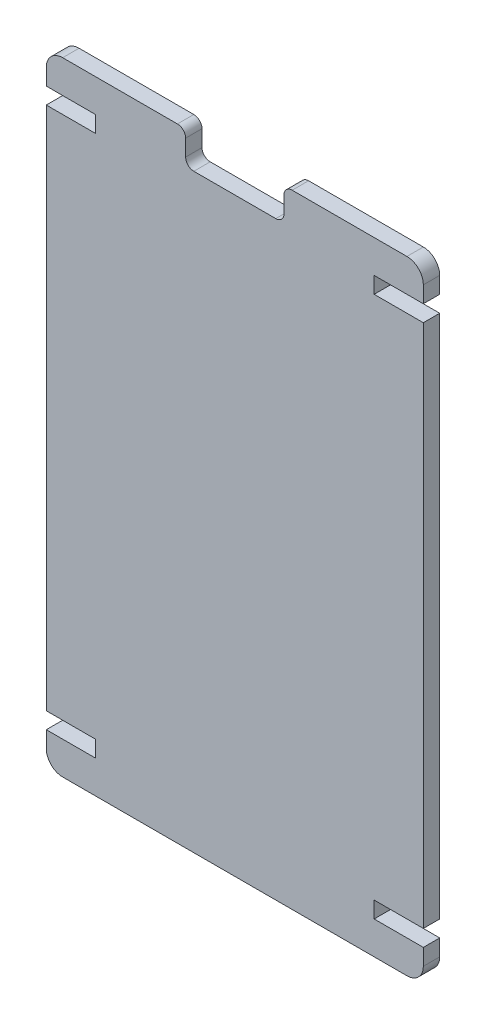
ISO-10303-21;
HEADER;
FILE_DESCRIPTION(('STEP AP214'),'2;1');
FILE_NAME('part.step','',(''),(''),'','','');
FILE_SCHEMA(('AUTOMOTIVE_DESIGN { 1 0 10303 214 1 1 1 1 }'));
ENDSEC;
DATA;
#1=APPLICATION_CONTEXT('core data for automotive mechanical design processes');
#2=APPLICATION_PROTOCOL_DEFINITION('international standard','automotive_design',2000,#1);
#3=PRODUCT_CONTEXT('',#1,'mechanical');
#4=PRODUCT('Part','Part','',(#3));
#5=PRODUCT_RELATED_PRODUCT_CATEGORY('part','',(#4));
#6=PRODUCT_DEFINITION_FORMATION('','',#4);
#7=PRODUCT_DEFINITION_CONTEXT('part definition',#1,'design');
#8=PRODUCT_DEFINITION('design','',#6,#7);
#9=PRODUCT_DEFINITION_SHAPE('','',#8);
#10=(LENGTH_UNIT() NAMED_UNIT(*) SI_UNIT(.MILLI.,.METRE.));
#11=(NAMED_UNIT(*) PLANE_ANGLE_UNIT() SI_UNIT($,.RADIAN.));
#12=(NAMED_UNIT(*) SI_UNIT($,.STERADIAN.) SOLID_ANGLE_UNIT());
#13=UNCERTAINTY_MEASURE_WITH_UNIT(LENGTH_MEASURE(1.E-05),#10,'distance_accuracy_value','');
#14=(GEOMETRIC_REPRESENTATION_CONTEXT(3) GLOBAL_UNCERTAINTY_ASSIGNED_CONTEXT((#13)) GLOBAL_UNIT_ASSIGNED_CONTEXT((#10,
#11,#12)) REPRESENTATION_CONTEXT('',''));
#15=CARTESIAN_POINT('',(0.,0.,0.));
#16=DIRECTION('',(0.,0.,1.));
#17=DIRECTION('',(1.,0.,0.));
#18=AXIS2_PLACEMENT_3D('',#15,#16,#17);
#19=CARTESIAN_POINT('',(-23.,-34.,2.));
#20=DIRECTION('',(1.,0.,0.));
#21=DIRECTION('',(0.,1.,0.));
#22=AXIS2_PLACEMENT_3D('',#19,#20,#21);
#23=PLANE('',#22);
#24=DIRECTION('',(0.,-1.,0.));
#25=VECTOR('',#24,1.);
#26=CARTESIAN_POINT('',(-23.,-34.,0.));
#27=LINE('',#26,#25);
#28=CARTESIAN_POINT('',(-23.,-34.,0.));
#29=VERTEX_POINT('',#28);
#30=CARTESIAN_POINT('',(-23.,-36.,0.));
#31=VERTEX_POINT('',#30);
#32=EDGE_CURVE('E273',#29,#31,#27,.T.);
#33=ORIENTED_EDGE('',*,*,#32,.T.);
#34=DIRECTION('',(0.,0.,-1.));
#35=VECTOR('',#34,1.);
#36=CARTESIAN_POINT('',(-23.,-36.,2.));
#37=LINE('',#36,#35);
#38=CARTESIAN_POINT('',(-23.,-36.,2.));
#39=VERTEX_POINT('',#38);
#40=EDGE_CURVE('E11',#39,#31,#37,.T.);
#41=ORIENTED_EDGE('',*,*,#40,.F.);
#42=DIRECTION('',(0.,-1.,0.));
#43=VECTOR('',#42,1.);
#44=CARTESIAN_POINT('',(-23.,-34.,2.));
#45=LINE('',#44,#43);
#46=CARTESIAN_POINT('',(-23.,-34.,2.));
#47=VERTEX_POINT('',#46);
#48=EDGE_CURVE('E335',#47,#39,#45,.T.);
#49=ORIENTED_EDGE('',*,*,#48,.F.);
#50=DIRECTION('',(0.,0.,-1.));
#51=VECTOR('',#50,1.);
#52=CARTESIAN_POINT('',(-23.,-34.,2.));
#53=LINE('',#52,#51);
#54=EDGE_CURVE('E269',#47,#29,#53,.T.);
#55=ORIENTED_EDGE('',*,*,#54,.T.);
#56=EDGE_LOOP('',(#33,#41,#49,#55));
#57=FACE_BOUND('',#56,.T.);
#58=ADVANCED_FACE('F33',(#57),#23,.F.);
#59=CARTESIAN_POINT('',(-21.,-36.,2.));
#60=DIRECTION('',(0.,0.,-1.));
#61=DIRECTION('',(-1.,0.,0.));
#62=AXIS2_PLACEMENT_3D('',#59,#60,#61);
#63=CYLINDRICAL_SURFACE('',#62,2.);
#64=CARTESIAN_POINT('',(-21.,-36.,0.));
#65=DIRECTION('',(0.,0.,1.));
#66=DIRECTION('',(1.,0.,0.));
#67=AXIS2_PLACEMENT_3D('',#64,#65,#66);
#68=CIRCLE('',#67,2.);
#69=CARTESIAN_POINT('',(-21.,-38.,0.));
#70=VERTEX_POINT('',#69);
#71=EDGE_CURVE('E276',#31,#70,#68,.T.);
#72=ORIENTED_EDGE('',*,*,#71,.T.);
#73=DIRECTION('',(0.,0.,-1.));
#74=VECTOR('',#73,1.);
#75=CARTESIAN_POINT('',(-21.,-38.,2.));
#76=LINE('',#75,#74);
#77=CARTESIAN_POINT('',(-21.,-38.,2.));
#78=VERTEX_POINT('',#77);
#79=EDGE_CURVE('E41',#78,#70,#76,.T.);
#80=ORIENTED_EDGE('',*,*,#79,.F.);
#81=CARTESIAN_POINT('',(-21.,-36.,2.));
#82=DIRECTION('',(0.,0.,1.));
#83=DIRECTION('',(1.,0.,0.));
#84=AXIS2_PLACEMENT_3D('',#81,#82,#83);
#85=CIRCLE('',#84,2.);
#86=EDGE_CURVE('E164',#39,#78,#85,.T.);
#87=ORIENTED_EDGE('',*,*,#86,.F.);
#88=ORIENTED_EDGE('',*,*,#40,.T.);
#89=EDGE_LOOP('',(#72,#80,#87,#88));
#90=FACE_BOUND('',#89,.T.);
#91=ADVANCED_FACE('F513',(#90),#63,.T.);
#92=CARTESIAN_POINT('',(21.,-38.,2.));
#93=DIRECTION('',(0.,1.,0.));
#94=DIRECTION('',(-1.,0.,0.));
#95=AXIS2_PLACEMENT_3D('',#92,#93,#94);
#96=PLANE('',#95);
#97=DIRECTION('',(1.,0.,0.));
#98=VECTOR('',#97,1.);
#99=CARTESIAN_POINT('',(21.,-38.,0.));
#100=LINE('',#99,#98);
#101=CARTESIAN_POINT('',(21.,-38.,0.));
#102=VERTEX_POINT('',#101);
#103=EDGE_CURVE('E278',#70,#102,#100,.T.);
#104=ORIENTED_EDGE('',*,*,#103,.T.);
#105=DIRECTION('',(0.,0.,-1.));
#106=VECTOR('',#105,1.);
#107=CARTESIAN_POINT('',(21.,-38.,2.));
#108=LINE('',#107,#106);
#109=CARTESIAN_POINT('',(21.,-38.,2.));
#110=VERTEX_POINT('',#109);
#111=EDGE_CURVE('E414',#110,#102,#108,.T.);
#112=ORIENTED_EDGE('',*,*,#111,.F.);
#113=DIRECTION('',(1.,0.,0.));
#114=VECTOR('',#113,1.);
#115=CARTESIAN_POINT('',(21.,-38.,2.));
#116=LINE('',#115,#114);
#117=EDGE_CURVE('E422',#78,#110,#116,.T.);
#118=ORIENTED_EDGE('',*,*,#117,.F.);
#119=ORIENTED_EDGE('',*,*,#79,.T.);
#120=EDGE_LOOP('',(#104,#112,#118,#119));
#121=FACE_BOUND('',#120,.T.);
#122=ADVANCED_FACE('F420',(#121),#96,.F.);
#123=CARTESIAN_POINT('',(21.,-36.,2.));
#124=DIRECTION('',(0.,0.,-1.));
#125=DIRECTION('',(-1.,0.,0.));
#126=AXIS2_PLACEMENT_3D('',#123,#124,#125);
#127=CYLINDRICAL_SURFACE('',#126,2.);
#128=CARTESIAN_POINT('',(21.,-36.,0.));
#129=DIRECTION('',(0.,0.,1.));
#130=DIRECTION('',(-1.,0.,0.));
#131=AXIS2_PLACEMENT_3D('',#128,#129,#130);
#132=CIRCLE('',#131,2.);
#133=CARTESIAN_POINT('',(23.,-36.,0.));
#134=VERTEX_POINT('',#133);
#135=EDGE_CURVE('E280',#102,#134,#132,.T.);
#136=ORIENTED_EDGE('',*,*,#135,.T.);
#137=DIRECTION('',(0.,0.,-1.));
#138=VECTOR('',#137,1.);
#139=CARTESIAN_POINT('',(23.,-36.,2.));
#140=LINE('',#139,#138);
#141=CARTESIAN_POINT('',(23.,-36.,2.));
#142=VERTEX_POINT('',#141);
#143=EDGE_CURVE('E411',#142,#134,#140,.T.);
#144=ORIENTED_EDGE('',*,*,#143,.F.);
#145=CARTESIAN_POINT('',(21.,-36.,2.));
#146=DIRECTION('',(0.,0.,1.));
#147=DIRECTION('',(-1.,0.,0.));
#148=AXIS2_PLACEMENT_3D('',#145,#146,#147);
#149=CIRCLE('',#148,2.);
#150=EDGE_CURVE('E440',#110,#142,#149,.T.);
#151=ORIENTED_EDGE('',*,*,#150,.F.);
#152=ORIENTED_EDGE('',*,*,#111,.T.);
#153=EDGE_LOOP('',(#136,#144,#151,#152));
#154=FACE_BOUND('',#153,.T.);
#155=ADVANCED_FACE('F431',(#154),#127,.T.);
#156=CARTESIAN_POINT('',(23.,-34.,2.));
#157=DIRECTION('',(-1.,0.,0.));
#158=DIRECTION('',(0.,0.,1.));
#159=AXIS2_PLACEMENT_3D('',#156,#157,#158);
#160=PLANE('',#159);
#161=DIRECTION('',(0.,1.,0.));
#162=VECTOR('',#161,1.);
#163=CARTESIAN_POINT('',(23.,-34.,0.));
#164=LINE('',#163,#162);
#165=CARTESIAN_POINT('',(23.,-34.,0.));
#166=VERTEX_POINT('',#165);
#167=EDGE_CURVE('E282',#134,#166,#164,.T.);
#168=ORIENTED_EDGE('',*,*,#167,.T.);
#169=DIRECTION('',(0.,0.,-1.));
#170=VECTOR('',#169,1.);
#171=CARTESIAN_POINT('',(23.,-34.,2.));
#172=LINE('',#171,#170);
#173=CARTESIAN_POINT('',(23.,-34.,2.));
#174=VERTEX_POINT('',#173);
#175=EDGE_CURVE('E408',#174,#166,#172,.T.);
#176=ORIENTED_EDGE('',*,*,#175,.F.);
#177=DIRECTION('',(0.,1.,0.));
#178=VECTOR('',#177,1.);
#179=CARTESIAN_POINT('',(23.,-34.,2.));
#180=LINE('',#179,#178);
#181=EDGE_CURVE('E437',#142,#174,#180,.T.);
#182=ORIENTED_EDGE('',*,*,#181,.F.);
#183=ORIENTED_EDGE('',*,*,#143,.T.);
#184=EDGE_LOOP('',(#168,#176,#182,#183));
#185=FACE_BOUND('',#184,.T.);
#186=ADVANCED_FACE('F435',(#185),#160,.F.);
#187=CARTESIAN_POINT('',(23.,-34.,2.));
#188=DIRECTION('',(0.,-1.,0.));
#189=DIRECTION('',(0.,0.,-1.));
#190=AXIS2_PLACEMENT_3D('',#187,#188,#189);
#191=PLANE('',#190);
#192=DIRECTION('',(-1.,0.,0.));
#193=VECTOR('',#192,1.);
#194=CARTESIAN_POINT('',(23.,-34.,0.));
#195=LINE('',#194,#193);
#196=CARTESIAN_POINT('',(17.,-34.,0.));
#197=VERTEX_POINT('',#196);
#198=EDGE_CURVE('E284',#166,#197,#195,.T.);
#199=ORIENTED_EDGE('',*,*,#198,.T.);
#200=DIRECTION('',(0.,0.,-1.));
#201=VECTOR('',#200,1.);
#202=CARTESIAN_POINT('',(17.,-34.,2.));
#203=LINE('',#202,#201);
#204=CARTESIAN_POINT('',(17.,-34.,2.));
#205=VERTEX_POINT('',#204);
#206=EDGE_CURVE('E405',#205,#197,#203,.T.);
#207=ORIENTED_EDGE('',*,*,#206,.F.);
#208=DIRECTION('',(-1.,0.,0.));
#209=VECTOR('',#208,1.);
#210=CARTESIAN_POINT('',(23.,-34.,2.));
#211=LINE('',#210,#209);
#212=EDGE_CURVE('E439',#174,#205,#211,.T.);
#213=ORIENTED_EDGE('',*,*,#212,.F.);
#214=ORIENTED_EDGE('',*,*,#175,.T.);
#215=EDGE_LOOP('',(#199,#207,#213,#214));
#216=FACE_BOUND('',#215,.T.);
#217=ADVANCED_FACE('F526',(#216),#191,.F.);
#218=CARTESIAN_POINT('',(17.,-34.,2.));
#219=DIRECTION('',(-1.,0.,0.));
#220=DIRECTION('',(0.,-1.,0.));
#221=AXIS2_PLACEMENT_3D('',#218,#219,#220);
#222=PLANE('',#221);
#223=DIRECTION('',(0.,1.,0.));
#224=VECTOR('',#223,1.);
#225=CARTESIAN_POINT('',(17.,-34.,0.));
#226=LINE('',#225,#224);
#227=CARTESIAN_POINT('',(17.,-32.,0.));
#228=VERTEX_POINT('',#227);
#229=EDGE_CURVE('E286',#197,#228,#226,.T.);
#230=ORIENTED_EDGE('',*,*,#229,.T.);
#231=DIRECTION('',(0.,0.,-1.));
#232=VECTOR('',#231,1.);
#233=CARTESIAN_POINT('',(17.,-32.,2.));
#234=LINE('',#233,#232);
#235=CARTESIAN_POINT('',(17.,-32.,2.));
#236=VERTEX_POINT('',#235);
#237=EDGE_CURVE('E402',#236,#228,#234,.T.);
#238=ORIENTED_EDGE('',*,*,#237,.F.);
#239=DIRECTION('',(0.,1.,0.));
#240=VECTOR('',#239,1.);
#241=CARTESIAN_POINT('',(17.,-34.,2.));
#242=LINE('',#241,#240);
#243=EDGE_CURVE('E442',#205,#236,#242,.T.);
#244=ORIENTED_EDGE('',*,*,#243,.F.);
#245=ORIENTED_EDGE('',*,*,#206,.T.);
#246=EDGE_LOOP('',(#230,#238,#244,#245));
#247=FACE_BOUND('',#246,.T.);
#248=ADVANCED_FACE('F529',(#247),#222,.F.);
#249=CARTESIAN_POINT('',(17.,-32.,2.));
#250=DIRECTION('',(0.,1.,0.));
#251=DIRECTION('',(0.,0.,1.));
#252=AXIS2_PLACEMENT_3D('',#249,#250,#251);
#253=PLANE('',#252);
#254=DIRECTION('',(1.,0.,0.));
#255=VECTOR('',#254,1.);
#256=CARTESIAN_POINT('',(17.,-32.,0.));
#257=LINE('',#256,#255);
#258=CARTESIAN_POINT('',(23.,-32.,0.));
#259=VERTEX_POINT('',#258);
#260=EDGE_CURVE('E288',#228,#259,#257,.T.);
#261=ORIENTED_EDGE('',*,*,#260,.T.);
#262=DIRECTION('',(0.,0.,-1.));
#263=VECTOR('',#262,1.);
#264=CARTESIAN_POINT('',(23.,-32.,2.));
#265=LINE('',#264,#263);
#266=CARTESIAN_POINT('',(23.,-32.,2.));
#267=VERTEX_POINT('',#266);
#268=EDGE_CURVE('E399',#267,#259,#265,.T.);
#269=ORIENTED_EDGE('',*,*,#268,.F.);
#270=DIRECTION('',(1.,0.,0.));
#271=VECTOR('',#270,1.);
#272=CARTESIAN_POINT('',(17.,-32.,2.));
#273=LINE('',#272,#271);
#274=EDGE_CURVE('E448',#236,#267,#273,.T.);
#275=ORIENTED_EDGE('',*,*,#274,.F.);
#276=ORIENTED_EDGE('',*,*,#237,.T.);
#277=EDGE_LOOP('',(#261,#269,#275,#276));
#278=FACE_BOUND('',#277,.T.);
#279=ADVANCED_FACE('F533',(#278),#253,.F.);
#280=CARTESIAN_POINT('',(23.,32.,2.));
#281=DIRECTION('',(-1.,0.,0.));
#282=DIRECTION('',(0.,-1.,0.));
#283=AXIS2_PLACEMENT_3D('',#280,#281,#282);
#284=PLANE('',#283);
#285=DIRECTION('',(0.,1.,0.));
#286=VECTOR('',#285,1.);
#287=CARTESIAN_POINT('',(23.,32.,0.));
#288=LINE('',#287,#286);
#289=CARTESIAN_POINT('',(23.,32.,0.));
#290=VERTEX_POINT('',#289);
#291=EDGE_CURVE('E290',#259,#290,#288,.T.);
#292=ORIENTED_EDGE('',*,*,#291,.T.);
#293=DIRECTION('',(0.,0.,-1.));
#294=VECTOR('',#293,1.);
#295=CARTESIAN_POINT('',(23.,32.,2.));
#296=LINE('',#295,#294);
#297=CARTESIAN_POINT('',(23.,32.,2.));
#298=VERTEX_POINT('',#297);
#299=EDGE_CURVE('E396',#298,#290,#296,.T.);
#300=ORIENTED_EDGE('',*,*,#299,.F.);
#301=DIRECTION('',(0.,1.,0.));
#302=VECTOR('',#301,1.);
#303=CARTESIAN_POINT('',(23.,32.,2.));
#304=LINE('',#303,#302);
#305=EDGE_CURVE('E450',#267,#298,#304,.T.);
#306=ORIENTED_EDGE('',*,*,#305,.F.);
#307=ORIENTED_EDGE('',*,*,#268,.T.);
#308=EDGE_LOOP('',(#292,#300,#306,#307));
#309=FACE_BOUND('',#308,.T.);
#310=ADVANCED_FACE('F537',(#309),#284,.F.);
#311=CARTESIAN_POINT('',(17.,32.,2.));
#312=DIRECTION('',(0.,-1.,0.));
#313=DIRECTION('',(0.,0.,-1.));
#314=AXIS2_PLACEMENT_3D('',#311,#312,#313);
#315=PLANE('',#314);
#316=DIRECTION('',(-1.,0.,0.));
#317=VECTOR('',#316,1.);
#318=CARTESIAN_POINT('',(17.,32.,0.));
#319=LINE('',#318,#317);
#320=CARTESIAN_POINT('',(17.,32.,0.));
#321=VERTEX_POINT('',#320);
#322=EDGE_CURVE('E292',#290,#321,#319,.T.);
#323=ORIENTED_EDGE('',*,*,#322,.T.);
#324=DIRECTION('',(0.,0.,-1.));
#325=VECTOR('',#324,1.);
#326=CARTESIAN_POINT('',(17.,32.,2.));
#327=LINE('',#326,#325);
#328=CARTESIAN_POINT('',(17.,32.,2.));
#329=VERTEX_POINT('',#328);
#330=EDGE_CURVE('E393',#329,#321,#327,.T.);
#331=ORIENTED_EDGE('',*,*,#330,.F.);
#332=DIRECTION('',(-1.,0.,0.));
#333=VECTOR('',#332,1.);
#334=CARTESIAN_POINT('',(17.,32.,2.));
#335=LINE('',#334,#333);
#336=EDGE_CURVE('E452',#298,#329,#335,.T.);
#337=ORIENTED_EDGE('',*,*,#336,.F.);
#338=ORIENTED_EDGE('',*,*,#299,.T.);
#339=EDGE_LOOP('',(#323,#331,#337,#338));
#340=FACE_BOUND('',#339,.T.);
#341=ADVANCED_FACE('F541',(#340),#315,.F.);
#342=CARTESIAN_POINT('',(17.,34.,2.));
#343=DIRECTION('',(-1.,0.,0.));
#344=DIRECTION('',(0.,-1.,0.));
#345=AXIS2_PLACEMENT_3D('',#342,#343,#344);
#346=PLANE('',#345);
#347=DIRECTION('',(0.,1.,0.));
#348=VECTOR('',#347,1.);
#349=CARTESIAN_POINT('',(17.,34.,0.));
#350=LINE('',#349,#348);
#351=CARTESIAN_POINT('',(17.,34.,0.));
#352=VERTEX_POINT('',#351);
#353=EDGE_CURVE('E294',#321,#352,#350,.T.);
#354=ORIENTED_EDGE('',*,*,#353,.T.);
#355=DIRECTION('',(0.,0.,-1.));
#356=VECTOR('',#355,1.);
#357=CARTESIAN_POINT('',(17.,34.,2.));
#358=LINE('',#357,#356);
#359=CARTESIAN_POINT('',(17.,34.,2.));
#360=VERTEX_POINT('',#359);
#361=EDGE_CURVE('E390',#360,#352,#358,.T.);
#362=ORIENTED_EDGE('',*,*,#361,.F.);
#363=DIRECTION('',(0.,1.,0.));
#364=VECTOR('',#363,1.);
#365=CARTESIAN_POINT('',(17.,34.,2.));
#366=LINE('',#365,#364);
#367=EDGE_CURVE('E454',#329,#360,#366,.T.);
#368=ORIENTED_EDGE('',*,*,#367,.F.);
#369=ORIENTED_EDGE('',*,*,#330,.T.);
#370=EDGE_LOOP('',(#354,#362,#368,#369));
#371=FACE_BOUND('',#370,.T.);
#372=ADVANCED_FACE('F545',(#371),#346,.F.);
#373=CARTESIAN_POINT('',(23.,34.,2.));
#374=DIRECTION('',(0.,1.,0.));
#375=DIRECTION('',(0.,0.,1.));
#376=AXIS2_PLACEMENT_3D('',#373,#374,#375);
#377=PLANE('',#376);
#378=DIRECTION('',(1.,0.,0.));
#379=VECTOR('',#378,1.);
#380=CARTESIAN_POINT('',(23.,34.,0.));
#381=LINE('',#380,#379);
#382=CARTESIAN_POINT('',(23.,34.,0.));
#383=VERTEX_POINT('',#382);
#384=EDGE_CURVE('E296',#352,#383,#381,.T.);
#385=ORIENTED_EDGE('',*,*,#384,.T.);
#386=DIRECTION('',(0.,0.,-1.));
#387=VECTOR('',#386,1.);
#388=CARTESIAN_POINT('',(23.,34.,2.));
#389=LINE('',#388,#387);
#390=CARTESIAN_POINT('',(23.,34.,2.));
#391=VERTEX_POINT('',#390);
#392=EDGE_CURVE('E387',#391,#383,#389,.T.);
#393=ORIENTED_EDGE('',*,*,#392,.F.);
#394=DIRECTION('',(1.,0.,0.));
#395=VECTOR('',#394,1.);
#396=CARTESIAN_POINT('',(23.,34.,2.));
#397=LINE('',#396,#395);
#398=EDGE_CURVE('E456',#360,#391,#397,.T.);
#399=ORIENTED_EDGE('',*,*,#398,.F.);
#400=ORIENTED_EDGE('',*,*,#361,.T.);
#401=EDGE_LOOP('',(#385,#393,#399,#400));
#402=FACE_BOUND('',#401,.T.);
#403=ADVANCED_FACE('F549',(#402),#377,.F.);
#404=CARTESIAN_POINT('',(23.,36.,2.));
#405=DIRECTION('',(-1.,0.,0.));
#406=DIRECTION('',(0.,0.,1.));
#407=AXIS2_PLACEMENT_3D('',#404,#405,#406);
#408=PLANE('',#407);
#409=DIRECTION('',(0.,1.,0.));
#410=VECTOR('',#409,1.);
#411=CARTESIAN_POINT('',(23.,36.,0.));
#412=LINE('',#411,#410);
#413=CARTESIAN_POINT('',(23.,36.,0.));
#414=VERTEX_POINT('',#413);
#415=EDGE_CURVE('E298',#383,#414,#412,.T.);
#416=ORIENTED_EDGE('',*,*,#415,.T.);
#417=DIRECTION('',(0.,0.,-1.));
#418=VECTOR('',#417,1.);
#419=CARTESIAN_POINT('',(23.,36.,2.));
#420=LINE('',#419,#418);
#421=CARTESIAN_POINT('',(23.,36.,2.));
#422=VERTEX_POINT('',#421);
#423=EDGE_CURVE('E384',#422,#414,#420,.T.);
#424=ORIENTED_EDGE('',*,*,#423,.F.);
#425=DIRECTION('',(0.,1.,0.));
#426=VECTOR('',#425,1.);
#427=CARTESIAN_POINT('',(23.,36.,2.));
#428=LINE('',#427,#426);
#429=EDGE_CURVE('E458',#391,#422,#428,.T.);
#430=ORIENTED_EDGE('',*,*,#429,.F.);
#431=ORIENTED_EDGE('',*,*,#392,.T.);
#432=EDGE_LOOP('',(#416,#424,#430,#431));
#433=FACE_BOUND('',#432,.T.);
#434=ADVANCED_FACE('F553',(#433),#408,.F.);
#435=CARTESIAN_POINT('',(21.,36.,2.));
#436=DIRECTION('',(0.,0.,-1.));
#437=DIRECTION('',(-1.,0.,0.));
#438=AXIS2_PLACEMENT_3D('',#435,#436,#437);
#439=CYLINDRICAL_SURFACE('',#438,2.00000000000001);
#440=CARTESIAN_POINT('',(21.,36.,0.));
#441=DIRECTION('',(0.,0.,1.));
#442=DIRECTION('',(1.,0.,0.));
#443=AXIS2_PLACEMENT_3D('',#440,#441,#442);
#444=CIRCLE('',#443,2.00000000000001);
#445=CARTESIAN_POINT('',(21.,38.,0.));
#446=VERTEX_POINT('',#445);
#447=EDGE_CURVE('E300',#414,#446,#444,.T.);
#448=ORIENTED_EDGE('',*,*,#447,.T.);
#449=DIRECTION('',(0.,0.,-1.));
#450=VECTOR('',#449,1.);
#451=CARTESIAN_POINT('',(21.,38.,2.));
#452=LINE('',#451,#450);
#453=CARTESIAN_POINT('',(21.,38.,2.));
#454=VERTEX_POINT('',#453);
#455=EDGE_CURVE('E381',#454,#446,#452,.T.);
#456=ORIENTED_EDGE('',*,*,#455,.F.);
#457=CARTESIAN_POINT('',(21.,36.,2.));
#458=DIRECTION('',(0.,0.,1.));
#459=DIRECTION('',(1.,0.,0.));
#460=AXIS2_PLACEMENT_3D('',#457,#458,#459);
#461=CIRCLE('',#460,2.00000000000001);
#462=EDGE_CURVE('E460',#422,#454,#461,.T.);
#463=ORIENTED_EDGE('',*,*,#462,.F.);
#464=ORIENTED_EDGE('',*,*,#423,.T.);
#465=EDGE_LOOP('',(#448,#456,#463,#464));
#466=FACE_BOUND('',#465,.T.);
#467=ADVANCED_FACE('F557',(#466),#439,.T.);
#468=CARTESIAN_POINT('',(7.,38.,2.));
#469=DIRECTION('',(0.,-1.,0.));
#470=DIRECTION('',(0.,0.,-1.));
#471=AXIS2_PLACEMENT_3D('',#468,#469,#470);
#472=PLANE('',#471);
#473=DIRECTION('',(-1.,0.,0.));
#474=VECTOR('',#473,1.);
#475=CARTESIAN_POINT('',(7.,38.,0.));
#476=LINE('',#475,#474);
#477=CARTESIAN_POINT('',(7.,38.,0.));
#478=VERTEX_POINT('',#477);
#479=EDGE_CURVE('E302',#446,#478,#476,.T.);
#480=ORIENTED_EDGE('',*,*,#479,.T.);
#481=DIRECTION('',(0.,0.,-1.));
#482=VECTOR('',#481,1.);
#483=CARTESIAN_POINT('',(7.,38.,2.));
#484=LINE('',#483,#482);
#485=CARTESIAN_POINT('',(7.,38.,2.));
#486=VERTEX_POINT('',#485);
#487=EDGE_CURVE('E378',#486,#478,#484,.T.);
#488=ORIENTED_EDGE('',*,*,#487,.F.);
#489=DIRECTION('',(-1.,0.,0.));
#490=VECTOR('',#489,1.);
#491=CARTESIAN_POINT('',(7.,38.,2.));
#492=LINE('',#491,#490);
#493=EDGE_CURVE('E462',#454,#486,#492,.T.);
#494=ORIENTED_EDGE('',*,*,#493,.F.);
#495=ORIENTED_EDGE('',*,*,#455,.T.);
#496=EDGE_LOOP('',(#480,#488,#494,#495));
#497=FACE_BOUND('',#496,.T.);
#498=ADVANCED_FACE('F561',(#497),#472,.F.);
#499=CARTESIAN_POINT('',(6.99999999999999,37.,2.));
#500=DIRECTION('',(0.,0.,-1.));
#501=DIRECTION('',(-1.,0.,0.));
#502=AXIS2_PLACEMENT_3D('',#499,#500,#501);
#503=CYLINDRICAL_SURFACE('',#502,1.);
#504=CARTESIAN_POINT('',(6.99999999999999,37.,0.));
#505=DIRECTION('',(0.,0.,1.));
#506=DIRECTION('',(1.,0.,0.));
#507=AXIS2_PLACEMENT_3D('',#504,#505,#506);
#508=CIRCLE('',#507,1.);
#509=CARTESIAN_POINT('',(5.99999999999999,37.,0.));
#510=VERTEX_POINT('',#509);
#511=EDGE_CURVE('E304',#478,#510,#508,.T.);
#512=ORIENTED_EDGE('',*,*,#511,.T.);
#513=DIRECTION('',(0.,0.,-1.));
#514=VECTOR('',#513,1.);
#515=CARTESIAN_POINT('',(5.99999999999999,37.,2.));
#516=LINE('',#515,#514);
#517=CARTESIAN_POINT('',(5.99999999999999,37.,2.));
#518=VERTEX_POINT('',#517);
#519=EDGE_CURVE('E375',#518,#510,#516,.T.);
#520=ORIENTED_EDGE('',*,*,#519,.F.);
#521=CARTESIAN_POINT('',(6.99999999999999,37.,2.));
#522=DIRECTION('',(0.,0.,1.));
#523=DIRECTION('',(1.,0.,0.));
#524=AXIS2_PLACEMENT_3D('',#521,#522,#523);
#525=CIRCLE('',#524,1.);
#526=EDGE_CURVE('E464',#486,#518,#525,.T.);
#527=ORIENTED_EDGE('',*,*,#526,.F.);
#528=ORIENTED_EDGE('',*,*,#487,.T.);
#529=EDGE_LOOP('',(#512,#520,#527,#528));
#530=FACE_BOUND('',#529,.T.);
#531=ADVANCED_FACE('F565',(#530),#503,.T.);
#532=CARTESIAN_POINT('',(6.,35.,2.));
#533=DIRECTION('',(1.,0.,0.));
#534=DIRECTION('',(0.,1.,0.));
#535=AXIS2_PLACEMENT_3D('',#532,#533,#534);
#536=PLANE('',#535);
#537=DIRECTION('',(0.,-1.,0.));
#538=VECTOR('',#537,1.);
#539=CARTESIAN_POINT('',(6.,35.,0.));
#540=LINE('',#539,#538);
#541=CARTESIAN_POINT('',(6.,35.,0.));
#542=VERTEX_POINT('',#541);
#543=EDGE_CURVE('E306',#510,#542,#540,.T.);
#544=ORIENTED_EDGE('',*,*,#543,.T.);
#545=DIRECTION('',(0.,0.,-1.));
#546=VECTOR('',#545,1.);
#547=CARTESIAN_POINT('',(6.,35.,2.));
#548=LINE('',#547,#546);
#549=CARTESIAN_POINT('',(6.,35.,2.));
#550=VERTEX_POINT('',#549);
#551=EDGE_CURVE('E372',#550,#542,#548,.T.);
#552=ORIENTED_EDGE('',*,*,#551,.F.);
#553=DIRECTION('',(0.,-1.,0.));
#554=VECTOR('',#553,1.);
#555=CARTESIAN_POINT('',(6.,35.,2.));
#556=LINE('',#555,#554);
#557=EDGE_CURVE('E466',#518,#550,#556,.T.);
#558=ORIENTED_EDGE('',*,*,#557,.F.);
#559=ORIENTED_EDGE('',*,*,#519,.T.);
#560=EDGE_LOOP('',(#544,#552,#558,#559));
#561=FACE_BOUND('',#560,.T.);
#562=ADVANCED_FACE('F569',(#561),#536,.F.);
#563=CARTESIAN_POINT('',(5.,35.,2.));
#564=DIRECTION('',(0.,0.,-1.));
#565=DIRECTION('',(-1.,0.,0.));
#566=AXIS2_PLACEMENT_3D('',#563,#564,#565);
#567=CYLINDRICAL_SURFACE('',#566,1.);
#568=CARTESIAN_POINT('',(5.,35.,0.));
#569=DIRECTION('',(0.,0.,-1.));
#570=DIRECTION('',(-1.,0.,0.));
#571=AXIS2_PLACEMENT_3D('',#568,#569,#570);
#572=CIRCLE('',#571,1.);
#573=CARTESIAN_POINT('',(4.99999999999999,34.,0.));
#574=VERTEX_POINT('',#573);
#575=EDGE_CURVE('E308',#542,#574,#572,.T.);
#576=ORIENTED_EDGE('',*,*,#575,.T.);
#577=DIRECTION('',(0.,0.,-1.));
#578=VECTOR('',#577,1.);
#579=CARTESIAN_POINT('',(4.99999999999999,34.,2.));
#580=LINE('',#579,#578);
#581=CARTESIAN_POINT('',(4.99999999999999,34.,2.));
#582=VERTEX_POINT('',#581);
#583=EDGE_CURVE('E369',#582,#574,#580,.T.);
#584=ORIENTED_EDGE('',*,*,#583,.F.);
#585=CARTESIAN_POINT('',(5.,35.,2.));
#586=DIRECTION('',(0.,0.,-1.));
#587=DIRECTION('',(-1.,0.,0.));
#588=AXIS2_PLACEMENT_3D('',#585,#586,#587);
#589=CIRCLE('',#588,1.);
#590=EDGE_CURVE('E468',#550,#582,#589,.T.);
#591=ORIENTED_EDGE('',*,*,#590,.F.);
#592=ORIENTED_EDGE('',*,*,#551,.T.);
#593=EDGE_LOOP('',(#576,#584,#591,#592));
#594=FACE_BOUND('',#593,.T.);
#595=ADVANCED_FACE('F573',(#594),#567,.F.);
#596=CARTESIAN_POINT('',(-5.,34.,2.));
#597=DIRECTION('',(0.,-1.,0.));
#598=DIRECTION('',(1.,0.,0.));
#599=AXIS2_PLACEMENT_3D('',#596,#597,#598);
#600=PLANE('',#599);
#601=DIRECTION('',(-1.,0.,0.));
#602=VECTOR('',#601,1.);
#603=CARTESIAN_POINT('',(-5.,34.,0.));
#604=LINE('',#603,#602);
#605=CARTESIAN_POINT('',(-5.,34.,0.));
#606=VERTEX_POINT('',#605);
#607=EDGE_CURVE('E310',#574,#606,#604,.T.);
#608=ORIENTED_EDGE('',*,*,#607,.T.);
#609=DIRECTION('',(0.,0.,-1.));
#610=VECTOR('',#609,1.);
#611=CARTESIAN_POINT('',(-5.,34.,2.));
#612=LINE('',#611,#610);
#613=CARTESIAN_POINT('',(-5.,34.,2.));
#614=VERTEX_POINT('',#613);
#615=EDGE_CURVE('E366',#614,#606,#612,.T.);
#616=ORIENTED_EDGE('',*,*,#615,.F.);
#617=DIRECTION('',(-1.,0.,0.));
#618=VECTOR('',#617,1.);
#619=CARTESIAN_POINT('',(-5.,34.,2.));
#620=LINE('',#619,#618);
#621=EDGE_CURVE('E470',#582,#614,#620,.T.);
#622=ORIENTED_EDGE('',*,*,#621,.F.);
#623=ORIENTED_EDGE('',*,*,#583,.T.);
#624=EDGE_LOOP('',(#608,#616,#622,#623));
#625=FACE_BOUND('',#624,.T.);
#626=ADVANCED_FACE('F577',(#625),#600,.F.);
#627=CARTESIAN_POINT('',(-5.,35.,2.));
#628=DIRECTION('',(0.,0.,-1.));
#629=DIRECTION('',(-1.,0.,0.));
#630=AXIS2_PLACEMENT_3D('',#627,#628,#629);
#631=CYLINDRICAL_SURFACE('',#630,1.);
#632=CARTESIAN_POINT('',(-5.,35.,0.));
#633=DIRECTION('',(0.,0.,-1.));
#634=DIRECTION('',(1.,0.,0.));
#635=AXIS2_PLACEMENT_3D('',#632,#633,#634);
#636=CIRCLE('',#635,1.);
#637=CARTESIAN_POINT('',(-6.,35.,0.));
#638=VERTEX_POINT('',#637);
#639=EDGE_CURVE('E312',#606,#638,#636,.T.);
#640=ORIENTED_EDGE('',*,*,#639,.T.);
#641=DIRECTION('',(0.,0.,-1.));
#642=VECTOR('',#641,1.);
#643=CARTESIAN_POINT('',(-6.,35.,2.));
#644=LINE('',#643,#642);
#645=CARTESIAN_POINT('',(-6.,35.,2.));
#646=VERTEX_POINT('',#645);
#647=EDGE_CURVE('E363',#646,#638,#644,.T.);
#648=ORIENTED_EDGE('',*,*,#647,.F.);
#649=CARTESIAN_POINT('',(-5.,35.,2.));
#650=DIRECTION('',(0.,0.,-1.));
#651=DIRECTION('',(1.,0.,0.));
#652=AXIS2_PLACEMENT_3D('',#649,#650,#651);
#653=CIRCLE('',#652,1.);
#654=EDGE_CURVE('E472',#614,#646,#653,.T.);
#655=ORIENTED_EDGE('',*,*,#654,.F.);
#656=ORIENTED_EDGE('',*,*,#615,.T.);
#657=EDGE_LOOP('',(#640,#648,#655,#656));
#658=FACE_BOUND('',#657,.T.);
#659=ADVANCED_FACE('F581',(#658),#631,.F.);
#660=CARTESIAN_POINT('',(-6.,35.,2.));
#661=DIRECTION('',(-1.,0.,0.));
#662=DIRECTION('',(0.,-1.,0.));
#663=AXIS2_PLACEMENT_3D('',#660,#661,#662);
#664=PLANE('',#663);
#665=DIRECTION('',(0.,1.,0.));
#666=VECTOR('',#665,1.);
#667=CARTESIAN_POINT('',(-6.,35.,0.));
#668=LINE('',#667,#666);
#669=CARTESIAN_POINT('',(-6.00000000000001,37.,0.));
#670=VERTEX_POINT('',#669);
#671=EDGE_CURVE('E314',#638,#670,#668,.T.);
#672=ORIENTED_EDGE('',*,*,#671,.T.);
#673=DIRECTION('',(0.,0.,-1.));
#674=VECTOR('',#673,1.);
#675=CARTESIAN_POINT('',(-6.00000000000001,37.,2.));
#676=LINE('',#675,#674);
#677=CARTESIAN_POINT('',(-6.00000000000001,37.,2.));
#678=VERTEX_POINT('',#677);
#679=EDGE_CURVE('E360',#678,#670,#676,.T.);
#680=ORIENTED_EDGE('',*,*,#679,.F.);
#681=DIRECTION('',(0.,1.,0.));
#682=VECTOR('',#681,1.);
#683=CARTESIAN_POINT('',(-6.,35.,2.));
#684=LINE('',#683,#682);
#685=EDGE_CURVE('E474',#646,#678,#684,.T.);
#686=ORIENTED_EDGE('',*,*,#685,.F.);
#687=ORIENTED_EDGE('',*,*,#647,.T.);
#688=EDGE_LOOP('',(#672,#680,#686,#687));
#689=FACE_BOUND('',#688,.T.);
#690=ADVANCED_FACE('F585',(#689),#664,.F.);
#691=CARTESIAN_POINT('',(-7.00000000000001,37.,2.));
#692=DIRECTION('',(0.,0.,-1.));
#693=DIRECTION('',(-1.,0.,0.));
#694=AXIS2_PLACEMENT_3D('',#691,#692,#693);
#695=CYLINDRICAL_SURFACE('',#694,1.);
#696=CARTESIAN_POINT('',(-7.00000000000001,37.,0.));
#697=DIRECTION('',(0.,0.,1.));
#698=DIRECTION('',(1.,0.,0.));
#699=AXIS2_PLACEMENT_3D('',#696,#697,#698);
#700=CIRCLE('',#699,1.);
#701=CARTESIAN_POINT('',(-7.00000000000001,38.,0.));
#702=VERTEX_POINT('',#701);
#703=EDGE_CURVE('E316',#670,#702,#700,.T.);
#704=ORIENTED_EDGE('',*,*,#703,.T.);
#705=DIRECTION('',(0.,0.,-1.));
#706=VECTOR('',#705,1.);
#707=CARTESIAN_POINT('',(-7.00000000000001,38.,2.));
#708=LINE('',#707,#706);
#709=CARTESIAN_POINT('',(-7.00000000000001,38.,2.));
#710=VERTEX_POINT('',#709);
#711=EDGE_CURVE('E357',#710,#702,#708,.T.);
#712=ORIENTED_EDGE('',*,*,#711,.F.);
#713=CARTESIAN_POINT('',(-7.00000000000001,37.,2.));
#714=DIRECTION('',(0.,0.,1.));
#715=DIRECTION('',(1.,0.,0.));
#716=AXIS2_PLACEMENT_3D('',#713,#714,#715);
#717=CIRCLE('',#716,1.);
#718=EDGE_CURVE('E476',#678,#710,#717,.T.);
#719=ORIENTED_EDGE('',*,*,#718,.F.);
#720=ORIENTED_EDGE('',*,*,#679,.T.);
#721=EDGE_LOOP('',(#704,#712,#719,#720));
#722=FACE_BOUND('',#721,.T.);
#723=ADVANCED_FACE('F589',(#722),#695,.T.);
#724=CARTESIAN_POINT('',(-21.,38.,2.));
#725=DIRECTION('',(0.,-1.,0.));
#726=DIRECTION('',(0.,0.,-1.));
#727=AXIS2_PLACEMENT_3D('',#724,#725,#726);
#728=PLANE('',#727);
#729=DIRECTION('',(-1.,0.,0.));
#730=VECTOR('',#729,1.);
#731=CARTESIAN_POINT('',(-21.,38.,0.));
#732=LINE('',#731,#730);
#733=CARTESIAN_POINT('',(-21.,38.,0.));
#734=VERTEX_POINT('',#733);
#735=EDGE_CURVE('E318',#702,#734,#732,.T.);
#736=ORIENTED_EDGE('',*,*,#735,.T.);
#737=DIRECTION('',(0.,0.,-1.));
#738=VECTOR('',#737,1.);
#739=CARTESIAN_POINT('',(-21.,38.,2.));
#740=LINE('',#739,#738);
#741=CARTESIAN_POINT('',(-21.,38.,2.));
#742=VERTEX_POINT('',#741);
#743=EDGE_CURVE('E354',#742,#734,#740,.T.);
#744=ORIENTED_EDGE('',*,*,#743,.F.);
#745=DIRECTION('',(-1.,0.,0.));
#746=VECTOR('',#745,1.);
#747=CARTESIAN_POINT('',(-21.,38.,2.));
#748=LINE('',#747,#746);
#749=EDGE_CURVE('E478',#710,#742,#748,.T.);
#750=ORIENTED_EDGE('',*,*,#749,.F.);
#751=ORIENTED_EDGE('',*,*,#711,.T.);
#752=EDGE_LOOP('',(#736,#744,#750,#751));
#753=FACE_BOUND('',#752,.T.);
#754=ADVANCED_FACE('F593',(#753),#728,.F.);
#755=CARTESIAN_POINT('',(-21.,36.,2.));
#756=DIRECTION('',(0.,0.,-1.));
#757=DIRECTION('',(-1.,0.,0.));
#758=AXIS2_PLACEMENT_3D('',#755,#756,#757);
#759=CYLINDRICAL_SURFACE('',#758,2.);
#760=CARTESIAN_POINT('',(-21.,36.,0.));
#761=DIRECTION('',(0.,0.,1.));
#762=DIRECTION('',(1.,0.,0.));
#763=AXIS2_PLACEMENT_3D('',#760,#761,#762);
#764=CIRCLE('',#763,2.);
#765=CARTESIAN_POINT('',(-23.,36.,0.));
#766=VERTEX_POINT('',#765);
#767=EDGE_CURVE('E320',#734,#766,#764,.T.);
#768=ORIENTED_EDGE('',*,*,#767,.T.);
#769=DIRECTION('',(0.,0.,-1.));
#770=VECTOR('',#769,1.);
#771=CARTESIAN_POINT('',(-23.,36.,2.));
#772=LINE('',#771,#770);
#773=CARTESIAN_POINT('',(-23.,36.,2.));
#774=VERTEX_POINT('',#773);
#775=EDGE_CURVE('E351',#774,#766,#772,.T.);
#776=ORIENTED_EDGE('',*,*,#775,.F.);
#777=CARTESIAN_POINT('',(-21.,36.,2.));
#778=DIRECTION('',(0.,0.,1.));
#779=DIRECTION('',(1.,0.,0.));
#780=AXIS2_PLACEMENT_3D('',#777,#778,#779);
#781=CIRCLE('',#780,2.);
#782=EDGE_CURVE('E480',#742,#774,#781,.T.);
#783=ORIENTED_EDGE('',*,*,#782,.F.);
#784=ORIENTED_EDGE('',*,*,#743,.T.);
#785=EDGE_LOOP('',(#768,#776,#783,#784));
#786=FACE_BOUND('',#785,.T.);
#787=ADVANCED_FACE('F597',(#786),#759,.T.);
#788=CARTESIAN_POINT('',(-23.,36.,2.));
#789=DIRECTION('',(1.,0.,0.));
#790=DIRECTION('',(0.,0.,-1.));
#791=AXIS2_PLACEMENT_3D('',#788,#789,#790);
#792=PLANE('',#791);
#793=DIRECTION('',(0.,-1.,0.));
#794=VECTOR('',#793,1.);
#795=CARTESIAN_POINT('',(-23.,36.,0.));
#796=LINE('',#795,#794);
#797=CARTESIAN_POINT('',(-23.,34.,0.));
#798=VERTEX_POINT('',#797);
#799=EDGE_CURVE('E322',#766,#798,#796,.T.);
#800=ORIENTED_EDGE('',*,*,#799,.T.);
#801=DIRECTION('',(0.,0.,-1.));
#802=VECTOR('',#801,1.);
#803=CARTESIAN_POINT('',(-23.,34.,2.));
#804=LINE('',#803,#802);
#805=CARTESIAN_POINT('',(-23.,34.,2.));
#806=VERTEX_POINT('',#805);
#807=EDGE_CURVE('E348',#806,#798,#804,.T.);
#808=ORIENTED_EDGE('',*,*,#807,.F.);
#809=DIRECTION('',(0.,-1.,0.));
#810=VECTOR('',#809,1.);
#811=CARTESIAN_POINT('',(-23.,36.,2.));
#812=LINE('',#811,#810);
#813=EDGE_CURVE('E482',#774,#806,#812,.T.);
#814=ORIENTED_EDGE('',*,*,#813,.F.);
#815=ORIENTED_EDGE('',*,*,#775,.T.);
#816=EDGE_LOOP('',(#800,#808,#814,#815));
#817=FACE_BOUND('',#816,.T.);
#818=ADVANCED_FACE('F601',(#817),#792,.F.);
#819=CARTESIAN_POINT('',(-23.,34.,2.));
#820=DIRECTION('',(0.,1.,0.));
#821=DIRECTION('',(0.,0.,1.));
#822=AXIS2_PLACEMENT_3D('',#819,#820,#821);
#823=PLANE('',#822);
#824=DIRECTION('',(1.,0.,0.));
#825=VECTOR('',#824,1.);
#826=CARTESIAN_POINT('',(-23.,34.,0.));
#827=LINE('',#826,#825);
#828=CARTESIAN_POINT('',(-17.,34.,0.));
#829=VERTEX_POINT('',#828);
#830=EDGE_CURVE('E324',#798,#829,#827,.T.);
#831=ORIENTED_EDGE('',*,*,#830,.T.);
#832=DIRECTION('',(0.,0.,-1.));
#833=VECTOR('',#832,1.);
#834=CARTESIAN_POINT('',(-17.,34.,2.));
#835=LINE('',#834,#833);
#836=CARTESIAN_POINT('',(-17.,34.,2.));
#837=VERTEX_POINT('',#836);
#838=EDGE_CURVE('E345',#837,#829,#835,.T.);
#839=ORIENTED_EDGE('',*,*,#838,.F.);
#840=DIRECTION('',(1.,0.,0.));
#841=VECTOR('',#840,1.);
#842=CARTESIAN_POINT('',(-23.,34.,2.));
#843=LINE('',#842,#841);
#844=EDGE_CURVE('E484',#806,#837,#843,.T.);
#845=ORIENTED_EDGE('',*,*,#844,.F.);
#846=ORIENTED_EDGE('',*,*,#807,.T.);
#847=EDGE_LOOP('',(#831,#839,#845,#846));
#848=FACE_BOUND('',#847,.T.);
#849=ADVANCED_FACE('F605',(#848),#823,.F.);
#850=CARTESIAN_POINT('',(-17.,34.,2.));
#851=DIRECTION('',(1.,0.,0.));
#852=DIRECTION('',(0.,1.,0.));
#853=AXIS2_PLACEMENT_3D('',#850,#851,#852);
#854=PLANE('',#853);
#855=DIRECTION('',(0.,-1.,0.));
#856=VECTOR('',#855,1.);
#857=CARTESIAN_POINT('',(-17.,34.,0.));
#858=LINE('',#857,#856);
#859=CARTESIAN_POINT('',(-17.,32.,0.));
#860=VERTEX_POINT('',#859);
#861=EDGE_CURVE('E326',#829,#860,#858,.T.);
#862=ORIENTED_EDGE('',*,*,#861,.T.);
#863=DIRECTION('',(0.,0.,-1.));
#864=VECTOR('',#863,1.);
#865=CARTESIAN_POINT('',(-17.,32.,2.));
#866=LINE('',#865,#864);
#867=CARTESIAN_POINT('',(-17.,32.,2.));
#868=VERTEX_POINT('',#867);
#869=EDGE_CURVE('E342',#868,#860,#866,.T.);
#870=ORIENTED_EDGE('',*,*,#869,.F.);
#871=DIRECTION('',(0.,-1.,0.));
#872=VECTOR('',#871,1.);
#873=CARTESIAN_POINT('',(-17.,34.,2.));
#874=LINE('',#873,#872);
#875=EDGE_CURVE('E486',#837,#868,#874,.T.);
#876=ORIENTED_EDGE('',*,*,#875,.F.);
#877=ORIENTED_EDGE('',*,*,#838,.T.);
#878=EDGE_LOOP('',(#862,#870,#876,#877));
#879=FACE_BOUND('',#878,.T.);
#880=ADVANCED_FACE('F609',(#879),#854,.F.);
#881=CARTESIAN_POINT('',(-17.,32.,2.));
#882=DIRECTION('',(0.,-1.,0.));
#883=DIRECTION('',(0.,0.,-1.));
#884=AXIS2_PLACEMENT_3D('',#881,#882,#883);
#885=PLANE('',#884);
#886=DIRECTION('',(-1.,0.,0.));
#887=VECTOR('',#886,1.);
#888=CARTESIAN_POINT('',(-17.,32.,0.));
#889=LINE('',#888,#887);
#890=CARTESIAN_POINT('',(-23.,32.,0.));
#891=VERTEX_POINT('',#890);
#892=EDGE_CURVE('E328',#860,#891,#889,.T.);
#893=ORIENTED_EDGE('',*,*,#892,.T.);
#894=DIRECTION('',(0.,0.,-1.));
#895=VECTOR('',#894,1.);
#896=CARTESIAN_POINT('',(-23.,32.,2.));
#897=LINE('',#896,#895);
#898=CARTESIAN_POINT('',(-23.,32.,2.));
#899=VERTEX_POINT('',#898);
#900=EDGE_CURVE('E339',#899,#891,#897,.T.);
#901=ORIENTED_EDGE('',*,*,#900,.F.);
#902=DIRECTION('',(-1.,0.,0.));
#903=VECTOR('',#902,1.);
#904=CARTESIAN_POINT('',(-17.,32.,2.));
#905=LINE('',#904,#903);
#906=EDGE_CURVE('E488',#868,#899,#905,.T.);
#907=ORIENTED_EDGE('',*,*,#906,.F.);
#908=ORIENTED_EDGE('',*,*,#869,.T.);
#909=EDGE_LOOP('',(#893,#901,#907,#908));
#910=FACE_BOUND('',#909,.T.);
#911=ADVANCED_FACE('F494',(#910),#885,.F.);
#912=CARTESIAN_POINT('',(-23.,32.,2.));
#913=DIRECTION('',(1.,0.,0.));
#914=DIRECTION('',(0.,1.,0.));
#915=AXIS2_PLACEMENT_3D('',#912,#913,#914);
#916=PLANE('',#915);
#917=DIRECTION('',(0.,-1.,0.));
#918=VECTOR('',#917,1.);
#919=CARTESIAN_POINT('',(-23.,32.,0.));
#920=LINE('',#919,#918);
#921=CARTESIAN_POINT('',(-23.,-32.,0.));
#922=VERTEX_POINT('',#921);
#923=EDGE_CURVE('E330',#891,#922,#920,.T.);
#924=ORIENTED_EDGE('',*,*,#923,.T.);
#925=DIRECTION('',(0.,0.,-1.));
#926=VECTOR('',#925,1.);
#927=CARTESIAN_POINT('',(-23.,-32.,2.));
#928=LINE('',#927,#926);
#929=CARTESIAN_POINT('',(-23.,-32.,2.));
#930=VERTEX_POINT('',#929);
#931=EDGE_CURVE('E264',#930,#922,#928,.T.);
#932=ORIENTED_EDGE('',*,*,#931,.F.);
#933=DIRECTION('',(0.,-1.,0.));
#934=VECTOR('',#933,1.);
#935=CARTESIAN_POINT('',(-23.,32.,2.));
#936=LINE('',#935,#934);
#937=EDGE_CURVE('E255',#899,#930,#936,.T.);
#938=ORIENTED_EDGE('',*,*,#937,.F.);
#939=ORIENTED_EDGE('',*,*,#900,.T.);
#940=EDGE_LOOP('',(#924,#932,#938,#939));
#941=FACE_BOUND('',#940,.T.);
#942=ADVANCED_FACE('F498',(#941),#916,.F.);
#943=CARTESIAN_POINT('',(-17.,-32.,2.));
#944=DIRECTION('',(0.,1.,0.));
#945=DIRECTION('',(-1.,0.,0.));
#946=AXIS2_PLACEMENT_3D('',#943,#944,#945);
#947=PLANE('',#946);
#948=DIRECTION('',(1.,0.,0.));
#949=VECTOR('',#948,1.);
#950=CARTESIAN_POINT('',(-17.,-32.,0.));
#951=LINE('',#950,#949);
#952=CARTESIAN_POINT('',(-17.,-32.,0.));
#953=VERTEX_POINT('',#952);
#954=EDGE_CURVE('E263',#922,#953,#951,.T.);
#955=ORIENTED_EDGE('',*,*,#954,.T.);
#956=DIRECTION('',(0.,0.,-1.));
#957=VECTOR('',#956,1.);
#958=CARTESIAN_POINT('',(-17.,-32.,2.));
#959=LINE('',#958,#957);
#960=CARTESIAN_POINT('',(-17.,-32.,2.));
#961=VERTEX_POINT('',#960);
#962=EDGE_CURVE('E260',#961,#953,#959,.T.);
#963=ORIENTED_EDGE('',*,*,#962,.F.);
#964=DIRECTION('',(1.,0.,0.));
#965=VECTOR('',#964,1.);
#966=CARTESIAN_POINT('',(-17.,-32.,2.));
#967=LINE('',#966,#965);
#968=EDGE_CURVE('E249',#930,#961,#967,.T.);
#969=ORIENTED_EDGE('',*,*,#968,.F.);
#970=ORIENTED_EDGE('',*,*,#931,.T.);
#971=EDGE_LOOP('',(#955,#963,#969,#970));
#972=FACE_BOUND('',#971,.T.);
#973=ADVANCED_FACE('F261',(#972),#947,.F.);
#974=CARTESIAN_POINT('',(-17.,-34.,2.));
#975=DIRECTION('',(1.,0.,0.));
#976=DIRECTION('',(0.,1.,0.));
#977=AXIS2_PLACEMENT_3D('',#974,#975,#976);
#978=PLANE('',#977);
#979=DIRECTION('',(0.,-1.,0.));
#980=VECTOR('',#979,1.);
#981=CARTESIAN_POINT('',(-17.,-34.,0.));
#982=LINE('',#981,#980);
#983=CARTESIAN_POINT('',(-17.,-34.,0.));
#984=VERTEX_POINT('',#983);
#985=EDGE_CURVE('E150',#953,#984,#982,.T.);
#986=ORIENTED_EDGE('',*,*,#985,.T.);
#987=DIRECTION('',(0.,0.,-1.));
#988=VECTOR('',#987,1.);
#989=CARTESIAN_POINT('',(-17.,-34.,2.));
#990=LINE('',#989,#988);
#991=CARTESIAN_POINT('',(-17.,-34.,2.));
#992=VERTEX_POINT('',#991);
#993=EDGE_CURVE('E265',#992,#984,#990,.T.);
#994=ORIENTED_EDGE('',*,*,#993,.F.);
#995=DIRECTION('',(0.,-1.,0.));
#996=VECTOR('',#995,1.);
#997=CARTESIAN_POINT('',(-17.,-34.,2.));
#998=LINE('',#997,#996);
#999=EDGE_CURVE('E253',#961,#992,#998,.T.);
#1000=ORIENTED_EDGE('',*,*,#999,.F.);
#1001=ORIENTED_EDGE('',*,*,#962,.T.);
#1002=EDGE_LOOP('',(#986,#994,#1000,#1001));
#1003=FACE_BOUND('',#1002,.T.);
#1004=ADVANCED_FACE('F267',(#1003),#978,.F.);
#1005=CARTESIAN_POINT('',(-23.,-34.,2.));
#1006=DIRECTION('',(0.,-1.,0.));
#1007=DIRECTION('',(0.,0.,-1.));
#1008=AXIS2_PLACEMENT_3D('',#1005,#1006,#1007);
#1009=PLANE('',#1008);
#1010=DIRECTION('',(-1.,0.,0.));
#1011=VECTOR('',#1010,1.);
#1012=CARTESIAN_POINT('',(-23.,-34.,0.));
#1013=LINE('',#1012,#1011);
#1014=EDGE_CURVE('E156',#984,#29,#1013,.T.);
#1015=ORIENTED_EDGE('',*,*,#1014,.T.);
#1016=ORIENTED_EDGE('',*,*,#54,.F.);
#1017=DIRECTION('',(-1.,0.,0.));
#1018=VECTOR('',#1017,1.);
#1019=CARTESIAN_POINT('',(-23.,-34.,2.));
#1020=LINE('',#1019,#1018);
#1021=EDGE_CURVE('E49',#992,#47,#1020,.T.);
#1022=ORIENTED_EDGE('',*,*,#1021,.F.);
#1023=ORIENTED_EDGE('',*,*,#993,.T.);
#1024=EDGE_LOOP('',(#1015,#1016,#1022,#1023));
#1025=FACE_BOUND('',#1024,.T.);
#1026=ADVANCED_FACE('F502',(#1025),#1009,.F.);
#1027=CARTESIAN_POINT('',(-21.,-36.,2.));
#1028=DIRECTION('',(0.,0.,1.));
#1029=DIRECTION('',(1.,0.,0.));
#1030=AXIS2_PLACEMENT_3D('',#1027,#1028,#1029);
#1031=PLANE('',#1030);
#1032=ORIENTED_EDGE('',*,*,#48,.T.);
#1033=ORIENTED_EDGE('',*,*,#86,.T.);
#1034=ORIENTED_EDGE('',*,*,#117,.T.);
#1035=ORIENTED_EDGE('',*,*,#150,.T.);
#1036=ORIENTED_EDGE('',*,*,#181,.T.);
#1037=ORIENTED_EDGE('',*,*,#212,.T.);
#1038=ORIENTED_EDGE('',*,*,#243,.T.);
#1039=ORIENTED_EDGE('',*,*,#274,.T.);
#1040=ORIENTED_EDGE('',*,*,#305,.T.);
#1041=ORIENTED_EDGE('',*,*,#336,.T.);
#1042=ORIENTED_EDGE('',*,*,#367,.T.);
#1043=ORIENTED_EDGE('',*,*,#398,.T.);
#1044=ORIENTED_EDGE('',*,*,#429,.T.);
#1045=ORIENTED_EDGE('',*,*,#462,.T.);
#1046=ORIENTED_EDGE('',*,*,#493,.T.);
#1047=ORIENTED_EDGE('',*,*,#526,.T.);
#1048=ORIENTED_EDGE('',*,*,#557,.T.);
#1049=ORIENTED_EDGE('',*,*,#590,.T.);
#1050=ORIENTED_EDGE('',*,*,#621,.T.);
#1051=ORIENTED_EDGE('',*,*,#654,.T.);
#1052=ORIENTED_EDGE('',*,*,#685,.T.);
#1053=ORIENTED_EDGE('',*,*,#718,.T.);
#1054=ORIENTED_EDGE('',*,*,#749,.T.);
#1055=ORIENTED_EDGE('',*,*,#782,.T.);
#1056=ORIENTED_EDGE('',*,*,#813,.T.);
#1057=ORIENTED_EDGE('',*,*,#844,.T.);
#1058=ORIENTED_EDGE('',*,*,#875,.T.);
#1059=ORIENTED_EDGE('',*,*,#906,.T.);
#1060=ORIENTED_EDGE('',*,*,#937,.T.);
#1061=ORIENTED_EDGE('',*,*,#968,.T.);
#1062=ORIENTED_EDGE('',*,*,#999,.T.);
#1063=ORIENTED_EDGE('',*,*,#1021,.T.);
#1064=EDGE_LOOP('',(#1032,#1033,#1034,#1035,#1036,#1037,#1038,#1039,#1040,#1041,#1042,#1043,
#1044,#1045,#1046,#1047,#1048,#1049,#1050,#1051,#1052,#1053,#1054,#1055,#1056,#1057,#1058,#1059,
#1060,#1061,#1062,#1063));
#1065=FACE_BOUND('',#1064,.T.);
#1066=ADVANCED_FACE('F251',(#1065),#1031,.T.);
#1067=CARTESIAN_POINT('',(-21.,-36.,0.));
#1068=DIRECTION('',(0.,0.,1.));
#1069=DIRECTION('',(1.,0.,0.));
#1070=AXIS2_PLACEMENT_3D('',#1067,#1068,#1069);
#1071=PLANE('',#1070);
#1072=ORIENTED_EDGE('',*,*,#32,.F.);
#1073=ORIENTED_EDGE('',*,*,#1014,.F.);
#1074=ORIENTED_EDGE('',*,*,#985,.F.);
#1075=ORIENTED_EDGE('',*,*,#954,.F.);
#1076=ORIENTED_EDGE('',*,*,#923,.F.);
#1077=ORIENTED_EDGE('',*,*,#892,.F.);
#1078=ORIENTED_EDGE('',*,*,#861,.F.);
#1079=ORIENTED_EDGE('',*,*,#830,.F.);
#1080=ORIENTED_EDGE('',*,*,#799,.F.);
#1081=ORIENTED_EDGE('',*,*,#767,.F.);
#1082=ORIENTED_EDGE('',*,*,#735,.F.);
#1083=ORIENTED_EDGE('',*,*,#703,.F.);
#1084=ORIENTED_EDGE('',*,*,#671,.F.);
#1085=ORIENTED_EDGE('',*,*,#639,.F.);
#1086=ORIENTED_EDGE('',*,*,#607,.F.);
#1087=ORIENTED_EDGE('',*,*,#575,.F.);
#1088=ORIENTED_EDGE('',*,*,#543,.F.);
#1089=ORIENTED_EDGE('',*,*,#511,.F.);
#1090=ORIENTED_EDGE('',*,*,#479,.F.);
#1091=ORIENTED_EDGE('',*,*,#447,.F.);
#1092=ORIENTED_EDGE('',*,*,#415,.F.);
#1093=ORIENTED_EDGE('',*,*,#384,.F.);
#1094=ORIENTED_EDGE('',*,*,#353,.F.);
#1095=ORIENTED_EDGE('',*,*,#322,.F.);
#1096=ORIENTED_EDGE('',*,*,#291,.F.);
#1097=ORIENTED_EDGE('',*,*,#260,.F.);
#1098=ORIENTED_EDGE('',*,*,#229,.F.);
#1099=ORIENTED_EDGE('',*,*,#198,.F.);
#1100=ORIENTED_EDGE('',*,*,#167,.F.);
#1101=ORIENTED_EDGE('',*,*,#135,.F.);
#1102=ORIENTED_EDGE('',*,*,#103,.F.);
#1103=ORIENTED_EDGE('',*,*,#71,.F.);
#1104=EDGE_LOOP('',(#1072,#1073,#1074,#1075,#1076,#1077,#1078,#1079,#1080,#1081,#1082,#1083,
#1084,#1085,#1086,#1087,#1088,#1089,#1090,#1091,#1092,#1093,#1094,#1095,#1096,#1097,#1098,#1099,
#1100,#1101,#1102,#1103));
#1105=FACE_BOUND('',#1104,.T.);
#1106=ADVANCED_FACE('F426',(#1105),#1071,.F.);
#1107=CLOSED_SHELL('',(#58,#91,#122,#155,#186,#217,#248,#279,#310,#341,#372,#403,#434,#467,#498,
#531,#562,#595,#626,#659,#690,#723,#754,#787,#818,#849,#880,#911,#942,#973,#1004,#1026,#1066,#1106));
#1108=MANIFOLD_SOLID_BREP('B2',#1107);
#1109=ADVANCED_BREP_SHAPE_REPRESENTATION('',(#18,#1108),#14);
#1110=SHAPE_DEFINITION_REPRESENTATION(#9,#1109);
ENDSEC;
END-ISO-10303-21;
